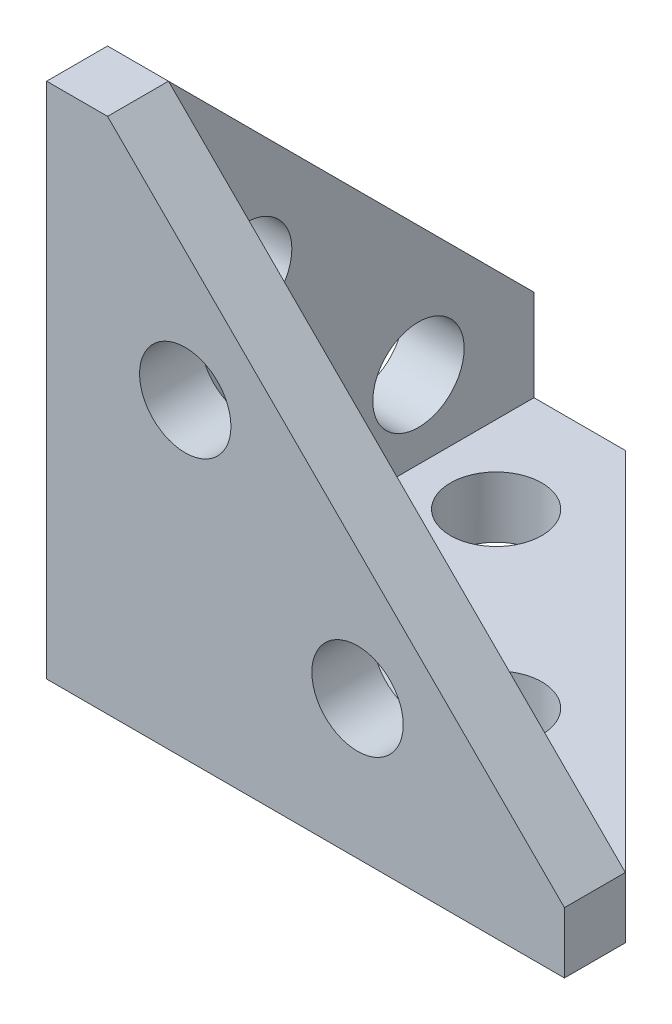
ISO-10303-21;
HEADER;
FILE_DESCRIPTION(('STEP AP214'),'2;1');
FILE_NAME('part.step','',(''),(''),'','','');
FILE_SCHEMA(('AUTOMOTIVE_DESIGN { 1 0 10303 214 1 1 1 1 }'));
ENDSEC;
DATA;
#1=APPLICATION_CONTEXT('core data for automotive mechanical design processes');
#2=APPLICATION_PROTOCOL_DEFINITION('international standard','automotive_design',2000,#1);
#3=PRODUCT_CONTEXT('',#1,'mechanical');
#4=PRODUCT('Part','Part','',(#3));
#5=PRODUCT_RELATED_PRODUCT_CATEGORY('part','',(#4));
#6=PRODUCT_DEFINITION_FORMATION('','',#4);
#7=PRODUCT_DEFINITION_CONTEXT('part definition',#1,'design');
#8=PRODUCT_DEFINITION('design','',#6,#7);
#9=PRODUCT_DEFINITION_SHAPE('','',#8);
#10=(LENGTH_UNIT() NAMED_UNIT(*) SI_UNIT(.MILLI.,.METRE.));
#11=(NAMED_UNIT(*) PLANE_ANGLE_UNIT() SI_UNIT($,.RADIAN.));
#12=(NAMED_UNIT(*) SI_UNIT($,.STERADIAN.) SOLID_ANGLE_UNIT());
#13=UNCERTAINTY_MEASURE_WITH_UNIT(LENGTH_MEASURE(1.E-05),#10,'distance_accuracy_value','');
#14=(GEOMETRIC_REPRESENTATION_CONTEXT(3) GLOBAL_UNCERTAINTY_ASSIGNED_CONTEXT((#13)) GLOBAL_UNIT_ASSIGNED_CONTEXT((#10,
#11,#12)) REPRESENTATION_CONTEXT('',''));
#15=CARTESIAN_POINT('',(0.,0.,0.));
#16=DIRECTION('',(0.,0.,1.));
#17=DIRECTION('',(1.,0.,0.));
#18=AXIS2_PLACEMENT_3D('',#15,#16,#17);
#19=CARTESIAN_POINT('',(0.,2.,-15.));
#20=DIRECTION('',(-0.707106781186547,0.,0.707106781186547));
#21=DIRECTION('',(0.707106781186548,0.,0.707106781186548));
#22=AXIS2_PLACEMENT_3D('',#19,#20,#21);
#23=PLANE('',#22);
#24=DIRECTION('',(0.,-1.,0.));
#25=VECTOR('',#24,1.);
#26=CARTESIAN_POINT('',(3.,2.,-12.));
#27=LINE('',#26,#25);
#28=CARTESIAN_POINT('',(3.,2.,-12.));
#29=VERTEX_POINT('',#28);
#30=CARTESIAN_POINT('',(3.,0.,-12.));
#31=VERTEX_POINT('',#30);
#32=EDGE_CURVE('E99',#29,#31,#27,.T.);
#33=ORIENTED_EDGE('',*,*,#32,.F.);
#34=DIRECTION('',(-0.707106781186547,0.,-0.707106781186547));
#35=VECTOR('',#34,1.);
#36=CARTESIAN_POINT('',(0.,2.,-15.));
#37=LINE('',#36,#35);
#38=CARTESIAN_POINT('',(15.,2.,0.));
#39=VERTEX_POINT('',#38);
#40=EDGE_CURVE('E142',#39,#29,#37,.T.);
#41=ORIENTED_EDGE('',*,*,#40,.F.);
#42=DIRECTION('',(0.,-1.,0.));
#43=VECTOR('',#42,1.);
#44=CARTESIAN_POINT('',(15.,2.,0.));
#45=LINE('',#44,#43);
#46=CARTESIAN_POINT('',(15.,0.,0.));
#47=VERTEX_POINT('',#46);
#48=EDGE_CURVE('E145',#39,#47,#45,.T.);
#49=ORIENTED_EDGE('',*,*,#48,.T.);
#50=DIRECTION('',(-0.707106781186547,0.,-0.707106781186547));
#51=VECTOR('',#50,1.);
#52=CARTESIAN_POINT('',(0.,0.,-15.));
#53=LINE('',#52,#51);
#54=EDGE_CURVE('E132',#47,#31,#53,.T.);
#55=ORIENTED_EDGE('',*,*,#54,.T.);
#56=EDGE_LOOP('',(#33,#41,#49,#55));
#57=FACE_BOUND('',#56,.T.);
#58=ADVANCED_FACE('F34',(#57),#23,.F.);
#59=CARTESIAN_POINT('',(0.,2.,0.));
#60=DIRECTION('',(0.,-1.,0.));
#61=DIRECTION('',(0.,0.,-1.));
#62=AXIS2_PLACEMENT_3D('',#59,#60,#61);
#63=PLANE('',#62);
#64=CARTESIAN_POINT('',(2.55025253169417,2.,-8.20710678118655));
#65=DIRECTION('',(0.,1.,0.));
#66=DIRECTION('',(0.,0.,1.));
#67=AXIS2_PLACEMENT_3D('',#64,#65,#66);
#68=CIRCLE('',#67,1.5);
#69=CARTESIAN_POINT('',(2.55025253169417,2.,-6.70710678118655));
#70=VERTEX_POINT('',#69);
#71=EDGE_CURVE('E172',#70,#70,#68,.T.);
#72=ORIENTED_EDGE('',*,*,#71,.F.);
#73=EDGE_LOOP('',(#72));
#74=FACE_BOUND('',#73,.T.);
#75=CARTESIAN_POINT('',(8.20710678118655,2.,-2.55025253169417));
#76=DIRECTION('',(0.,1.,0.));
#77=DIRECTION('',(0.,0.,1.));
#78=AXIS2_PLACEMENT_3D('',#75,#76,#77);
#79=CIRCLE('',#78,1.5);
#80=CARTESIAN_POINT('',(8.20710678118655,2.,-1.05025253169417));
#81=VERTEX_POINT('',#80);
#82=EDGE_CURVE('E175',#81,#81,#79,.T.);
#83=ORIENTED_EDGE('',*,*,#82,.F.);
#84=EDGE_LOOP('',(#83));
#85=FACE_BOUND('',#84,.T.);
#86=DIRECTION('',(1.,0.,0.));
#87=VECTOR('',#86,1.);
#88=CARTESIAN_POINT('',(0.,2.,-12.));
#89=LINE('',#88,#87);
#90=CARTESIAN_POINT('',(0.,2.,-12.));
#91=VERTEX_POINT('',#90);
#92=EDGE_CURVE('E184',#91,#29,#89,.T.);
#93=ORIENTED_EDGE('',*,*,#92,.F.);
#94=DIRECTION('',(0.,0.,1.));
#95=VECTOR('',#94,1.);
#96=CARTESIAN_POINT('',(0.,2.,0.));
#97=LINE('',#96,#95);
#98=CARTESIAN_POINT('',(0.,2.,0.));
#99=VERTEX_POINT('',#98);
#100=EDGE_CURVE('E137',#91,#99,#97,.T.);
#101=ORIENTED_EDGE('',*,*,#100,.T.);
#102=DIRECTION('',(1.,0.,0.));
#103=VECTOR('',#102,1.);
#104=CARTESIAN_POINT('',(0.,2.,0.));
#105=LINE('',#104,#103);
#106=EDGE_CURVE('E139',#99,#39,#105,.T.);
#107=ORIENTED_EDGE('',*,*,#106,.T.);
#108=ORIENTED_EDGE('',*,*,#40,.T.);
#109=EDGE_LOOP('',(#93,#101,#107,#108));
#110=FACE_BOUND('',#109,.T.);
#111=ADVANCED_FACE('F221',(#74,#85,#110),#63,.F.);
#112=CARTESIAN_POINT('',(0.,0.,0.));
#113=DIRECTION('',(0.,-1.,0.));
#114=DIRECTION('',(0.,0.,-1.));
#115=AXIS2_PLACEMENT_3D('',#112,#113,#114);
#116=PLANE('',#115);
#117=CARTESIAN_POINT('',(8.20710678118655,0.,-2.55025253169417));
#118=DIRECTION('',(0.,-1.,0.));
#119=DIRECTION('',(0.,0.,-1.));
#120=AXIS2_PLACEMENT_3D('',#117,#118,#119);
#121=CIRCLE('',#120,1.5);
#122=CARTESIAN_POINT('',(8.20710678118655,0.,-4.05025253169417));
#123=VERTEX_POINT('',#122);
#124=EDGE_CURVE('E173',#123,#123,#121,.T.);
#125=ORIENTED_EDGE('',*,*,#124,.F.);
#126=EDGE_LOOP('',(#125));
#127=FACE_BOUND('',#126,.T.);
#128=CARTESIAN_POINT('',(2.55025253169417,0.,-8.20710678118655));
#129=DIRECTION('',(0.,-1.,0.));
#130=DIRECTION('',(0.,0.,-1.));
#131=AXIS2_PLACEMENT_3D('',#128,#129,#130);
#132=CIRCLE('',#131,1.5);
#133=CARTESIAN_POINT('',(2.55025253169417,0.,-9.70710678118655));
#134=VERTEX_POINT('',#133);
#135=EDGE_CURVE('E170',#134,#134,#132,.T.);
#136=ORIENTED_EDGE('',*,*,#135,.F.);
#137=EDGE_LOOP('',(#136));
#138=FACE_BOUND('',#137,.T.);
#139=DIRECTION('',(0.,0.,1.));
#140=VECTOR('',#139,1.);
#141=CARTESIAN_POINT('',(-2.,0.,-15.));
#142=LINE('',#141,#140);
#143=CARTESIAN_POINT('',(-2.,0.,-12.));
#144=VERTEX_POINT('',#143);
#145=CARTESIAN_POINT('',(-2.,0.,2.));
#146=VERTEX_POINT('',#145);
#147=EDGE_CURVE('E108',#144,#146,#142,.T.);
#148=ORIENTED_EDGE('',*,*,#147,.F.);
#149=DIRECTION('',(-1.,0.,0.));
#150=VECTOR('',#149,1.);
#151=CARTESIAN_POINT('',(-2.,0.,-12.));
#152=LINE('',#151,#150);
#153=EDGE_CURVE('E96',#31,#144,#152,.T.);
#154=ORIENTED_EDGE('',*,*,#153,.F.);
#155=ORIENTED_EDGE('',*,*,#54,.F.);
#156=DIRECTION('',(0.,0.,-1.));
#157=VECTOR('',#156,1.);
#158=CARTESIAN_POINT('',(15.,0.,2.));
#159=LINE('',#158,#157);
#160=CARTESIAN_POINT('',(15.,0.,2.));
#161=VERTEX_POINT('',#160);
#162=EDGE_CURVE('E119',#161,#47,#159,.T.);
#163=ORIENTED_EDGE('',*,*,#162,.F.);
#164=DIRECTION('',(1.,0.,0.));
#165=VECTOR('',#164,1.);
#166=CARTESIAN_POINT('',(-2.,0.,2.));
#167=LINE('',#166,#165);
#168=EDGE_CURVE('E116',#146,#161,#167,.T.);
#169=ORIENTED_EDGE('',*,*,#168,.F.);
#170=EDGE_LOOP('',(#148,#154,#155,#163,#169));
#171=FACE_BOUND('',#170,.T.);
#172=ADVANCED_FACE('F113',(#127,#138,#171),#116,.T.);
#173=CARTESIAN_POINT('',(0.,0.,-15.));
#174=DIRECTION('',(1.,0.,0.));
#175=DIRECTION('',(0.,0.,-1.));
#176=AXIS2_PLACEMENT_3D('',#173,#174,#175);
#177=PLANE('',#176);
#178=CARTESIAN_POINT('',(0.,4.55025253169417,-8.20710678118655));
#179=DIRECTION('',(1.,0.,0.));
#180=DIRECTION('',(0.,0.,-1.));
#181=AXIS2_PLACEMENT_3D('',#178,#179,#180);
#182=CIRCLE('',#181,1.5);
#183=CARTESIAN_POINT('',(0.,4.55025253169417,-9.70710678118655));
#184=VERTEX_POINT('',#183);
#185=EDGE_CURVE('E161',#184,#184,#182,.T.);
#186=ORIENTED_EDGE('',*,*,#185,.F.);
#187=EDGE_LOOP('',(#186));
#188=FACE_BOUND('',#187,.T.);
#189=CARTESIAN_POINT('',(0.,10.2071067811865,-2.55025253169417));
#190=DIRECTION('',(1.,0.,0.));
#191=DIRECTION('',(0.,0.,-1.));
#192=AXIS2_PLACEMENT_3D('',#189,#190,#191);
#193=CIRCLE('',#192,1.5);
#194=CARTESIAN_POINT('',(0.,10.2071067811865,-4.05025253169417));
#195=VERTEX_POINT('',#194);
#196=EDGE_CURVE('E157',#195,#195,#193,.T.);
#197=ORIENTED_EDGE('',*,*,#196,.F.);
#198=EDGE_LOOP('',(#197));
#199=FACE_BOUND('',#198,.T.);
#200=ORIENTED_EDGE('',*,*,#100,.F.);
#201=DIRECTION('',(0.,1.,0.));
#202=VECTOR('',#201,1.);
#203=CARTESIAN_POINT('',(0.,0.,-12.));
#204=LINE('',#203,#202);
#205=CARTESIAN_POINT('',(0.,5.,-12.));
#206=VERTEX_POINT('',#205);
#207=EDGE_CURVE('E103',#91,#206,#204,.T.);
#208=ORIENTED_EDGE('',*,*,#207,.T.);
#209=DIRECTION('',(0.,-0.707106781186547,-0.707106781186547));
#210=VECTOR('',#209,1.);
#211=CARTESIAN_POINT('',(0.,2.,-15.));
#212=LINE('',#211,#210);
#213=CARTESIAN_POINT('',(0.,17.,0.));
#214=VERTEX_POINT('',#213);
#215=EDGE_CURVE('E201',#214,#206,#212,.T.);
#216=ORIENTED_EDGE('',*,*,#215,.F.);
#217=DIRECTION('',(0.,1.,0.));
#218=VECTOR('',#217,1.);
#219=CARTESIAN_POINT('',(0.,0.,0.));
#220=LINE('',#219,#218);
#221=EDGE_CURVE('E129',#99,#214,#220,.T.);
#222=ORIENTED_EDGE('',*,*,#221,.F.);
#223=EDGE_LOOP('',(#200,#208,#216,#222));
#224=FACE_BOUND('',#223,.T.);
#225=ADVANCED_FACE('F229',(#188,#199,#224),#177,.T.);
#226=CARTESIAN_POINT('',(-2.,0.,-15.));
#227=DIRECTION('',(-1.,0.,0.));
#228=DIRECTION('',(0.,0.,1.));
#229=AXIS2_PLACEMENT_3D('',#226,#227,#228);
#230=PLANE('',#229);
#231=CARTESIAN_POINT('',(-2.,4.55025253169417,-8.20710678118655));
#232=DIRECTION('',(-1.,0.,0.));
#233=DIRECTION('',(0.,0.,1.));
#234=AXIS2_PLACEMENT_3D('',#231,#232,#233);
#235=CIRCLE('',#234,1.5);
#236=CARTESIAN_POINT('',(-2.,4.55025253169417,-6.70710678118655));
#237=VERTEX_POINT('',#236);
#238=EDGE_CURVE('E158',#237,#237,#235,.T.);
#239=ORIENTED_EDGE('',*,*,#238,.F.);
#240=EDGE_LOOP('',(#239));
#241=FACE_BOUND('',#240,.T.);
#242=CARTESIAN_POINT('',(-2.,10.2071067811865,-2.55025253169417));
#243=DIRECTION('',(-1.,0.,0.));
#244=DIRECTION('',(0.,0.,1.));
#245=AXIS2_PLACEMENT_3D('',#242,#243,#244);
#246=CIRCLE('',#245,1.5);
#247=CARTESIAN_POINT('',(-2.,10.2071067811865,-1.05025253169417));
#248=VERTEX_POINT('',#247);
#249=EDGE_CURVE('E153',#248,#248,#246,.T.);
#250=ORIENTED_EDGE('',*,*,#249,.F.);
#251=EDGE_LOOP('',(#250));
#252=FACE_BOUND('',#251,.T.);
#253=DIRECTION('',(0.,0.707106781186548,0.707106781186548));
#254=VECTOR('',#253,1.);
#255=CARTESIAN_POINT('',(-2.,1.,-16.));
#256=LINE('',#255,#254);
#257=CARTESIAN_POINT('',(-2.,5.,-12.));
#258=VERTEX_POINT('',#257);
#259=CARTESIAN_POINT('',(-2.,17.,0.));
#260=VERTEX_POINT('',#259);
#261=EDGE_CURVE('E54',#258,#260,#256,.T.);
#262=ORIENTED_EDGE('',*,*,#261,.F.);
#263=DIRECTION('',(0.,1.,0.));
#264=VECTOR('',#263,1.);
#265=CARTESIAN_POINT('',(-2.,0.,-12.));
#266=LINE('',#265,#264);
#267=EDGE_CURVE('E47',#144,#258,#266,.T.);
#268=ORIENTED_EDGE('',*,*,#267,.F.);
#269=ORIENTED_EDGE('',*,*,#147,.T.);
#270=DIRECTION('',(0.,1.,0.));
#271=VECTOR('',#270,1.);
#272=CARTESIAN_POINT('',(-2.,0.,2.));
#273=LINE('',#272,#271);
#274=CARTESIAN_POINT('',(-2.,17.,2.));
#275=VERTEX_POINT('',#274);
#276=EDGE_CURVE('E128',#146,#275,#273,.T.);
#277=ORIENTED_EDGE('',*,*,#276,.T.);
#278=DIRECTION('',(0.,0.,1.));
#279=VECTOR('',#278,1.);
#280=CARTESIAN_POINT('',(-2.,17.,-15.));
#281=LINE('',#280,#279);
#282=EDGE_CURVE('E122',#260,#275,#281,.T.);
#283=ORIENTED_EDGE('',*,*,#282,.F.);
#284=EDGE_LOOP('',(#262,#268,#269,#277,#283));
#285=FACE_BOUND('',#284,.T.);
#286=ADVANCED_FACE('F106',(#241,#252,#285),#230,.T.);
#287=CARTESIAN_POINT('',(-15.,2.,-15.));
#288=DIRECTION('',(0.,-0.707106781186547,0.707106781186547));
#289=DIRECTION('',(0.,-0.707106781186548,-0.707106781186548));
#290=AXIS2_PLACEMENT_3D('',#287,#288,#289);
#291=PLANE('',#290);
#292=DIRECTION('',(1.,0.,0.));
#293=VECTOR('',#292,1.);
#294=CARTESIAN_POINT('',(-15.,5.,-12.));
#295=LINE('',#294,#293);
#296=EDGE_CURVE('E11',#258,#206,#295,.T.);
#297=ORIENTED_EDGE('',*,*,#296,.F.);
#298=ORIENTED_EDGE('',*,*,#261,.T.);
#299=DIRECTION('',(-1.,0.,0.));
#300=VECTOR('',#299,1.);
#301=CARTESIAN_POINT('',(0.,17.,0.));
#302=LINE('',#301,#300);
#303=EDGE_CURVE('E149',#214,#260,#302,.T.);
#304=ORIENTED_EDGE('',*,*,#303,.F.);
#305=ORIENTED_EDGE('',*,*,#215,.T.);
#306=EDGE_LOOP('',(#297,#298,#304,#305));
#307=FACE_BOUND('',#306,.T.);
#308=ADVANCED_FACE('F231',(#307),#291,.F.);
#309=CARTESIAN_POINT('',(15.,0.,0.));
#310=DIRECTION('',(0.,0.,-1.));
#311=DIRECTION('',(-1.,0.,0.));
#312=AXIS2_PLACEMENT_3D('',#309,#310,#311);
#313=PLANE('',#312);
#314=CARTESIAN_POINT('',(8.20710678118655,4.55025253169417,0.));
#315=DIRECTION('',(0.,0.,-1.));
#316=DIRECTION('',(-1.,0.,0.));
#317=AXIS2_PLACEMENT_3D('',#314,#315,#316);
#318=CIRCLE('',#317,1.5);
#319=CARTESIAN_POINT('',(6.70710678118655,4.55025253169417,0.));
#320=VERTEX_POINT('',#319);
#321=EDGE_CURVE('E169',#320,#320,#318,.T.);
#322=ORIENTED_EDGE('',*,*,#321,.F.);
#323=EDGE_LOOP('',(#322));
#324=FACE_BOUND('',#323,.T.);
#325=CARTESIAN_POINT('',(2.55025253169417,10.2071067811865,0.));
#326=DIRECTION('',(0.,0.,-1.));
#327=DIRECTION('',(-1.,0.,0.));
#328=AXIS2_PLACEMENT_3D('',#325,#326,#327);
#329=CIRCLE('',#328,1.5);
#330=CARTESIAN_POINT('',(1.05025253169417,10.2071067811865,0.));
#331=VERTEX_POINT('',#330);
#332=EDGE_CURVE('E165',#331,#331,#329,.T.);
#333=ORIENTED_EDGE('',*,*,#332,.F.);
#334=EDGE_LOOP('',(#333));
#335=FACE_BOUND('',#334,.T.);
#336=DIRECTION('',(-0.707106781186547,0.707106781186547,0.));
#337=VECTOR('',#336,1.);
#338=CARTESIAN_POINT('',(0.,17.,0.));
#339=LINE('',#338,#337);
#340=EDGE_CURVE('E156',#39,#214,#339,.T.);
#341=ORIENTED_EDGE('',*,*,#340,.F.);
#342=ORIENTED_EDGE('',*,*,#106,.F.);
#343=ORIENTED_EDGE('',*,*,#221,.T.);
#344=EDGE_LOOP('',(#341,#342,#343));
#345=FACE_BOUND('',#344,.T.);
#346=ADVANCED_FACE('F226',(#324,#335,#345),#313,.T.);
#347=CARTESIAN_POINT('',(15.,0.,2.));
#348=DIRECTION('',(1.,0.,0.));
#349=DIRECTION('',(0.,0.,-1.));
#350=AXIS2_PLACEMENT_3D('',#347,#348,#349);
#351=PLANE('',#350);
#352=DIRECTION('',(0.,0.,-1.));
#353=VECTOR('',#352,1.);
#354=CARTESIAN_POINT('',(15.,2.,15.));
#355=LINE('',#354,#353);
#356=CARTESIAN_POINT('',(15.,2.,2.));
#357=VERTEX_POINT('',#356);
#358=EDGE_CURVE('E197',#357,#39,#355,.T.);
#359=ORIENTED_EDGE('',*,*,#358,.F.);
#360=DIRECTION('',(0.,1.,0.));
#361=VECTOR('',#360,1.);
#362=CARTESIAN_POINT('',(15.,0.,2.));
#363=LINE('',#362,#361);
#364=EDGE_CURVE('E133',#161,#357,#363,.T.);
#365=ORIENTED_EDGE('',*,*,#364,.F.);
#366=ORIENTED_EDGE('',*,*,#162,.T.);
#367=ORIENTED_EDGE('',*,*,#48,.F.);
#368=EDGE_LOOP('',(#359,#365,#366,#367));
#369=FACE_BOUND('',#368,.T.);
#370=ADVANCED_FACE('F216',(#369),#351,.T.);
#371=CARTESIAN_POINT('',(-2.,0.,2.));
#372=DIRECTION('',(0.,0.,1.));
#373=DIRECTION('',(1.,0.,0.));
#374=AXIS2_PLACEMENT_3D('',#371,#372,#373);
#375=PLANE('',#374);
#376=CARTESIAN_POINT('',(8.20710678118655,4.55025253169417,2.));
#377=DIRECTION('',(0.,0.,1.));
#378=DIRECTION('',(1.,0.,0.));
#379=AXIS2_PLACEMENT_3D('',#376,#377,#378);
#380=CIRCLE('',#379,1.5);
#381=CARTESIAN_POINT('',(9.70710678118655,4.55025253169417,2.));
#382=VERTEX_POINT('',#381);
#383=EDGE_CURVE('E166',#382,#382,#380,.T.);
#384=ORIENTED_EDGE('',*,*,#383,.F.);
#385=EDGE_LOOP('',(#384));
#386=FACE_BOUND('',#385,.T.);
#387=CARTESIAN_POINT('',(2.55025253169417,10.2071067811865,2.));
#388=DIRECTION('',(0.,0.,1.));
#389=DIRECTION('',(1.,0.,0.));
#390=AXIS2_PLACEMENT_3D('',#387,#388,#389);
#391=CIRCLE('',#390,1.5);
#392=CARTESIAN_POINT('',(4.05025253169417,10.2071067811865,2.));
#393=VERTEX_POINT('',#392);
#394=EDGE_CURVE('E162',#393,#393,#391,.T.);
#395=ORIENTED_EDGE('',*,*,#394,.F.);
#396=EDGE_LOOP('',(#395));
#397=FACE_BOUND('',#396,.T.);
#398=DIRECTION('',(0.707106781186548,-0.707106781186548,0.));
#399=VECTOR('',#398,1.);
#400=CARTESIAN_POINT('',(7.5,9.5,2.));
#401=LINE('',#400,#399);
#402=CARTESIAN_POINT('',(0.,17.,2.));
#403=VERTEX_POINT('',#402);
#404=EDGE_CURVE('E199',#403,#357,#401,.T.);
#405=ORIENTED_EDGE('',*,*,#404,.F.);
#406=DIRECTION('',(1.,0.,0.));
#407=VECTOR('',#406,1.);
#408=CARTESIAN_POINT('',(-2.,17.,2.));
#409=LINE('',#408,#407);
#410=EDGE_CURVE('E117',#275,#403,#409,.T.);
#411=ORIENTED_EDGE('',*,*,#410,.F.);
#412=ORIENTED_EDGE('',*,*,#276,.F.);
#413=ORIENTED_EDGE('',*,*,#168,.T.);
#414=ORIENTED_EDGE('',*,*,#364,.T.);
#415=EDGE_LOOP('',(#405,#411,#412,#413,#414));
#416=FACE_BOUND('',#415,.T.);
#417=ADVANCED_FACE('F209',(#386,#397,#416),#375,.T.);
#418=CARTESIAN_POINT('',(0.,17.,0.));
#419=DIRECTION('',(0.,-1.,0.));
#420=DIRECTION('',(0.,0.,-1.));
#421=AXIS2_PLACEMENT_3D('',#418,#419,#420);
#422=PLANE('',#421);
#423=ORIENTED_EDGE('',*,*,#410,.T.);
#424=DIRECTION('',(0.,0.,-1.));
#425=VECTOR('',#424,1.);
#426=CARTESIAN_POINT('',(0.,17.,0.));
#427=LINE('',#426,#425);
#428=EDGE_CURVE('E41',#403,#214,#427,.T.);
#429=ORIENTED_EDGE('',*,*,#428,.T.);
#430=ORIENTED_EDGE('',*,*,#303,.T.);
#431=ORIENTED_EDGE('',*,*,#282,.T.);
#432=EDGE_LOOP('',(#423,#429,#430,#431));
#433=FACE_BOUND('',#432,.T.);
#434=ADVANCED_FACE('F205',(#433),#422,.F.);
#435=CARTESIAN_POINT('',(0.,17.,15.));
#436=DIRECTION('',(-0.707106781186547,-0.707106781186547,0.));
#437=DIRECTION('',(0.707106781186548,-0.707106781186548,0.));
#438=AXIS2_PLACEMENT_3D('',#435,#436,#437);
#439=PLANE('',#438);
#440=ORIENTED_EDGE('',*,*,#404,.T.);
#441=ORIENTED_EDGE('',*,*,#358,.T.);
#442=ORIENTED_EDGE('',*,*,#340,.T.);
#443=ORIENTED_EDGE('',*,*,#428,.F.);
#444=EDGE_LOOP('',(#440,#441,#442,#443));
#445=FACE_BOUND('',#444,.T.);
#446=ADVANCED_FACE('F212',(#445),#439,.F.);
#447=CARTESIAN_POINT('',(-15.,10.2071067811865,-2.55025253169417));
#448=DIRECTION('',(1.,0.,0.));
#449=DIRECTION('',(0.,0.,-1.));
#450=AXIS2_PLACEMENT_3D('',#447,#448,#449);
#451=CYLINDRICAL_SURFACE('',#450,1.5);
#452=ORIENTED_EDGE('',*,*,#249,.T.);
#453=EDGE_LOOP('',(#452));
#454=FACE_BOUND('',#453,.T.);
#455=ORIENTED_EDGE('',*,*,#196,.T.);
#456=EDGE_LOOP('',(#455));
#457=FACE_BOUND('',#456,.T.);
#458=ADVANCED_FACE('F271',(#454,#457),#451,.F.);
#459=CARTESIAN_POINT('',(-15.,4.55025253169417,-8.20710678118655));
#460=DIRECTION('',(1.,0.,0.));
#461=DIRECTION('',(0.,0.,-1.));
#462=AXIS2_PLACEMENT_3D('',#459,#460,#461);
#463=CYLINDRICAL_SURFACE('',#462,1.5);
#464=ORIENTED_EDGE('',*,*,#238,.T.);
#465=EDGE_LOOP('',(#464));
#466=FACE_BOUND('',#465,.T.);
#467=ORIENTED_EDGE('',*,*,#185,.T.);
#468=EDGE_LOOP('',(#467));
#469=FACE_BOUND('',#468,.T.);
#470=ADVANCED_FACE('F275',(#466,#469),#463,.F.);
#471=CARTESIAN_POINT('',(2.55025253169417,10.2071067811865,15.));
#472=DIRECTION('',(0.,0.,-1.));
#473=DIRECTION('',(-1.,0.,0.));
#474=AXIS2_PLACEMENT_3D('',#471,#472,#473);
#475=CYLINDRICAL_SURFACE('',#474,1.5);
#476=ORIENTED_EDGE('',*,*,#394,.T.);
#477=EDGE_LOOP('',(#476));
#478=FACE_BOUND('',#477,.T.);
#479=ORIENTED_EDGE('',*,*,#332,.T.);
#480=EDGE_LOOP('',(#479));
#481=FACE_BOUND('',#480,.T.);
#482=ADVANCED_FACE('F281',(#478,#481),#475,.F.);
#483=CARTESIAN_POINT('',(8.20710678118655,4.55025253169417,15.));
#484=DIRECTION('',(0.,0.,-1.));
#485=DIRECTION('',(-1.,0.,0.));
#486=AXIS2_PLACEMENT_3D('',#483,#484,#485);
#487=CYLINDRICAL_SURFACE('',#486,1.5);
#488=ORIENTED_EDGE('',*,*,#383,.T.);
#489=EDGE_LOOP('',(#488));
#490=FACE_BOUND('',#489,.T.);
#491=ORIENTED_EDGE('',*,*,#321,.T.);
#492=EDGE_LOOP('',(#491));
#493=FACE_BOUND('',#492,.T.);
#494=ADVANCED_FACE('F285',(#490,#493),#487,.F.);
#495=CARTESIAN_POINT('',(2.55025253169417,-13.,-8.20710678118655));
#496=DIRECTION('',(0.,1.,0.));
#497=DIRECTION('',(0.,0.,1.));
#498=AXIS2_PLACEMENT_3D('',#495,#496,#497);
#499=CYLINDRICAL_SURFACE('',#498,1.5);
#500=ORIENTED_EDGE('',*,*,#135,.T.);
#501=EDGE_LOOP('',(#500));
#502=FACE_BOUND('',#501,.T.);
#503=ORIENTED_EDGE('',*,*,#71,.T.);
#504=EDGE_LOOP('',(#503));
#505=FACE_BOUND('',#504,.T.);
#506=ADVANCED_FACE('F289',(#502,#505),#499,.F.);
#507=CARTESIAN_POINT('',(8.20710678118655,-13.,-2.55025253169417));
#508=DIRECTION('',(0.,1.,0.));
#509=DIRECTION('',(0.,0.,1.));
#510=AXIS2_PLACEMENT_3D('',#507,#508,#509);
#511=CYLINDRICAL_SURFACE('',#510,1.5);
#512=ORIENTED_EDGE('',*,*,#124,.T.);
#513=EDGE_LOOP('',(#512));
#514=FACE_BOUND('',#513,.T.);
#515=ORIENTED_EDGE('',*,*,#82,.T.);
#516=EDGE_LOOP('',(#515));
#517=FACE_BOUND('',#516,.T.);
#518=ADVANCED_FACE('F293',(#514,#517),#511,.F.);
#519=CARTESIAN_POINT('',(0.,0.,-12.));
#520=DIRECTION('',(0.,0.,-1.));
#521=DIRECTION('',(-1.,0.,0.));
#522=AXIS2_PLACEMENT_3D('',#519,#520,#521);
#523=PLANE('',#522);
#524=ORIENTED_EDGE('',*,*,#32,.T.);
#525=ORIENTED_EDGE('',*,*,#153,.T.);
#526=ORIENTED_EDGE('',*,*,#267,.T.);
#527=ORIENTED_EDGE('',*,*,#296,.T.);
#528=ORIENTED_EDGE('',*,*,#207,.F.);
#529=ORIENTED_EDGE('',*,*,#92,.T.);
#530=EDGE_LOOP('',(#524,#525,#526,#527,#528,#529));
#531=FACE_BOUND('',#530,.T.);
#532=ADVANCED_FACE('F97',(#531),#523,.T.);
#533=CLOSED_SHELL('',(#58,#111,#172,#225,#286,#308,#346,#370,#417,#434,#446,#458,#470,#482,#494,
#506,#518,#532));
#534=MANIFOLD_SOLID_BREP('B2',#533);
#535=ADVANCED_BREP_SHAPE_REPRESENTATION('',(#18,#534),#14);
#536=SHAPE_DEFINITION_REPRESENTATION(#9,#535);
ENDSEC;
END-ISO-10303-21;
